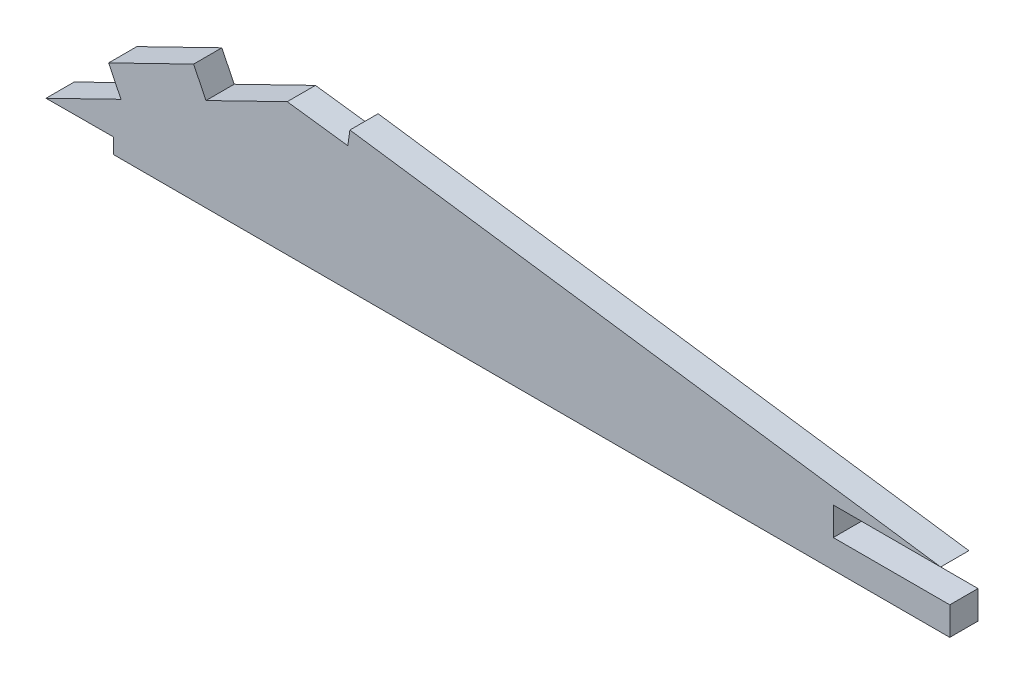
ISO-10303-21;
HEADER;
FILE_DESCRIPTION(('STEP AP214'),'2;1');
FILE_NAME('part.step','',(''),(''),'','','');
FILE_SCHEMA(('AUTOMOTIVE_DESIGN { 1 0 10303 214 1 1 1 1 }'));
ENDSEC;
DATA;
#1=APPLICATION_CONTEXT('core data for automotive mechanical design processes');
#2=APPLICATION_PROTOCOL_DEFINITION('international standard','automotive_design',2000,#1);
#3=PRODUCT_CONTEXT('',#1,'mechanical');
#4=PRODUCT('Part','Part','',(#3));
#5=PRODUCT_RELATED_PRODUCT_CATEGORY('part','',(#4));
#6=PRODUCT_DEFINITION_FORMATION('','',#4);
#7=PRODUCT_DEFINITION_CONTEXT('part definition',#1,'design');
#8=PRODUCT_DEFINITION('design','',#6,#7);
#9=PRODUCT_DEFINITION_SHAPE('','',#8);
#10=(LENGTH_UNIT() NAMED_UNIT(*) SI_UNIT(.MILLI.,.METRE.));
#11=(NAMED_UNIT(*) PLANE_ANGLE_UNIT() SI_UNIT($,.RADIAN.));
#12=(NAMED_UNIT(*) SI_UNIT($,.STERADIAN.) SOLID_ANGLE_UNIT());
#13=UNCERTAINTY_MEASURE_WITH_UNIT(LENGTH_MEASURE(1.E-05),#10,'distance_accuracy_value','');
#14=(GEOMETRIC_REPRESENTATION_CONTEXT(3) GLOBAL_UNCERTAINTY_ASSIGNED_CONTEXT((#13)) GLOBAL_UNIT_ASSIGNED_CONTEXT((#10,
#11,#12)) REPRESENTATION_CONTEXT('',''));
#15=CARTESIAN_POINT('',(0.,0.,0.));
#16=DIRECTION('',(0.,0.,1.));
#17=DIRECTION('',(1.,0.,0.));
#18=AXIS2_PLACEMENT_3D('',#15,#16,#17);
#19=CARTESIAN_POINT('',(6.87014244644078,3.92865761709263,2.));
#20=DIRECTION('',(-0.00388084579369452,0.999992469489609,0.));
#21=DIRECTION('',(-0.999992469489609,-0.00388084579369452,0.));
#22=AXIS2_PLACEMENT_3D('',#19,#20,#21);
#23=PLANE('',#22);
#24=DIRECTION('',(0.999992469489609,0.00388084579369452,0.));
#25=VECTOR('',#24,1.);
#26=CARTESIAN_POINT('',(6.87014244644078,3.92865761709263,0.));
#27=LINE('',#26,#25);
#28=CARTESIAN_POINT('',(2.08867664819272,3.91010134592361,0.));
#29=VERTEX_POINT('',#28);
#30=CARTESIAN_POINT('',(6.87014244644078,3.92865761709263,0.));
#31=VERTEX_POINT('',#30);
#32=EDGE_CURVE('E172',#29,#31,#27,.T.);
#33=ORIENTED_EDGE('',*,*,#32,.T.);
#34=DIRECTION('',(0.,0.,-1.));
#35=VECTOR('',#34,1.);
#36=CARTESIAN_POINT('',(6.87014244644078,3.92865761709263,2.));
#37=LINE('',#36,#35);
#38=CARTESIAN_POINT('',(6.87014244644078,3.92865761709263,2.));
#39=VERTEX_POINT('',#38);
#40=EDGE_CURVE('E11',#39,#31,#37,.T.);
#41=ORIENTED_EDGE('',*,*,#40,.F.);
#42=DIRECTION('',(0.999992469489609,0.00388084579369452,0.));
#43=VECTOR('',#42,1.);
#44=CARTESIAN_POINT('',(6.87014244644078,3.92865761709263,2.));
#45=LINE('',#44,#43);
#46=CARTESIAN_POINT('',(2.08867664819272,3.91010134592361,2.));
#47=VERTEX_POINT('',#46);
#48=EDGE_CURVE('E200',#47,#39,#45,.T.);
#49=ORIENTED_EDGE('',*,*,#48,.F.);
#50=DIRECTION('',(0.,0.,-1.));
#51=VECTOR('',#50,1.);
#52=CARTESIAN_POINT('',(2.08867664819272,3.91010134592361,2.));
#53=LINE('',#52,#51);
#54=EDGE_CURVE('E168',#47,#29,#53,.T.);
#55=ORIENTED_EDGE('',*,*,#54,.T.);
#56=EDGE_LOOP('',(#33,#41,#49,#55));
#57=FACE_BOUND('',#56,.T.);
#58=ADVANCED_FACE('F34',(#57),#23,.F.);
#59=CARTESIAN_POINT('',(6.87434607090663,2.84549352427084,2.));
#60=DIRECTION('',(0.99999246948962,0.00388084579083142,0.));
#61=DIRECTION('',(-0.00388084579083142,0.99999246948962,0.));
#62=AXIS2_PLACEMENT_3D('',#59,#60,#61);
#63=PLANE('',#62);
#64=DIRECTION('',(0.00388084579083142,-0.99999246948962,0.));
#65=VECTOR('',#64,1.);
#66=CARTESIAN_POINT('',(6.87434607090663,2.84549352427084,0.));
#67=LINE('',#66,#65);
#68=CARTESIAN_POINT('',(6.87434607090663,2.84549352427084,0.));
#69=VERTEX_POINT('',#68);
#70=EDGE_CURVE('E175',#31,#69,#67,.T.);
#71=ORIENTED_EDGE('',*,*,#70,.T.);
#72=DIRECTION('',(0.,0.,-1.));
#73=VECTOR('',#72,1.);
#74=CARTESIAN_POINT('',(6.87434607090663,2.84549352427084,2.));
#75=LINE('',#74,#73);
#76=CARTESIAN_POINT('',(6.87434607090663,2.84549352427084,2.));
#77=VERTEX_POINT('',#76);
#78=EDGE_CURVE('E42',#77,#69,#75,.T.);
#79=ORIENTED_EDGE('',*,*,#78,.F.);
#80=DIRECTION('',(0.00388084579083142,-0.99999246948962,0.));
#81=VECTOR('',#80,1.);
#82=CARTESIAN_POINT('',(6.87434607090663,2.84549352427084,2.));
#83=LINE('',#82,#81);
#84=EDGE_CURVE('E114',#39,#77,#83,.T.);
#85=ORIENTED_EDGE('',*,*,#84,.F.);
#86=ORIENTED_EDGE('',*,*,#40,.T.);
#87=EDGE_LOOP('',(#71,#79,#85,#86));
#88=FACE_BOUND('',#87,.T.);
#89=ADVANCED_FACE('F293',(#88),#63,.F.);
#90=CARTESIAN_POINT('',(6.87434607090663,2.84549352427084,2.));
#91=DIRECTION('',(0.,1.,0.));
#92=DIRECTION('',(0.,0.,1.));
#93=AXIS2_PLACEMENT_3D('',#90,#91,#92);
#94=PLANE('',#93);
#95=DIRECTION('',(1.,0.,0.));
#96=VECTOR('',#95,1.);
#97=CARTESIAN_POINT('',(6.87434607090663,2.84549352427084,0.));
#98=LINE('',#97,#96);
#99=CARTESIAN_POINT('',(66.1354490341429,2.84549352427084,0.));
#100=VERTEX_POINT('',#99);
#101=EDGE_CURVE('E177',#69,#100,#98,.T.);
#102=ORIENTED_EDGE('',*,*,#101,.T.);
#103=DIRECTION('',(0.,0.,-1.));
#104=VECTOR('',#103,1.);
#105=CARTESIAN_POINT('',(66.1354490341429,2.84549352427084,2.));
#106=LINE('',#105,#104);
#107=CARTESIAN_POINT('',(66.1354490341429,2.84549352427084,2.));
#108=VERTEX_POINT('',#107);
#109=EDGE_CURVE('E228',#108,#100,#106,.T.);
#110=ORIENTED_EDGE('',*,*,#109,.F.);
#111=DIRECTION('',(1.,0.,0.));
#112=VECTOR('',#111,1.);
#113=CARTESIAN_POINT('',(6.87434607090663,2.84549352427084,2.));
#114=LINE('',#113,#112);
#115=EDGE_CURVE('E236',#77,#108,#114,.T.);
#116=ORIENTED_EDGE('',*,*,#115,.F.);
#117=ORIENTED_EDGE('',*,*,#78,.T.);
#118=EDGE_LOOP('',(#102,#110,#116,#117));
#119=FACE_BOUND('',#118,.T.);
#120=ADVANCED_FACE('F234',(#119),#94,.F.);
#121=CARTESIAN_POINT('',(66.1354490341429,2.84549352427084,2.));
#122=DIRECTION('',(-1.,0.,0.));
#123=DIRECTION('',(0.,0.,1.));
#124=AXIS2_PLACEMENT_3D('',#121,#122,#123);
#125=PLANE('',#124);
#126=DIRECTION('',(0.,1.,0.));
#127=VECTOR('',#126,1.);
#128=CARTESIAN_POINT('',(66.1354490341429,2.84549352427084,0.));
#129=LINE('',#128,#127);
#130=CARTESIAN_POINT('',(66.1354490341429,4.84549352427084,0.));
#131=VERTEX_POINT('',#130);
#132=EDGE_CURVE('E179',#100,#131,#129,.T.);
#133=ORIENTED_EDGE('',*,*,#132,.T.);
#134=DIRECTION('',(0.,0.,-1.));
#135=VECTOR('',#134,1.);
#136=CARTESIAN_POINT('',(66.1354490341429,4.84549352427084,2.));
#137=LINE('',#136,#135);
#138=CARTESIAN_POINT('',(66.1354490341429,4.84549352427084,2.));
#139=VERTEX_POINT('',#138);
#140=EDGE_CURVE('E225',#139,#131,#137,.T.);
#141=ORIENTED_EDGE('',*,*,#140,.F.);
#142=DIRECTION('',(0.,1.,0.));
#143=VECTOR('',#142,1.);
#144=CARTESIAN_POINT('',(66.1354490341429,2.84549352427084,2.));
#145=LINE('',#144,#143);
#146=EDGE_CURVE('E254',#108,#139,#145,.T.);
#147=ORIENTED_EDGE('',*,*,#146,.F.);
#148=ORIENTED_EDGE('',*,*,#109,.T.);
#149=EDGE_LOOP('',(#133,#141,#147,#148));
#150=FACE_BOUND('',#149,.T.);
#151=ADVANCED_FACE('F245',(#150),#125,.F.);
#152=CARTESIAN_POINT('',(57.8792726381617,4.84549352427084,2.));
#153=DIRECTION('',(0.,-1.,0.));
#154=DIRECTION('',(0.,0.,-1.));
#155=AXIS2_PLACEMENT_3D('',#152,#153,#154);
#156=PLANE('',#155);
#157=DIRECTION('',(-1.,0.,0.));
#158=VECTOR('',#157,1.);
#159=CARTESIAN_POINT('',(57.8792726381617,4.84549352427084,0.));
#160=LINE('',#159,#158);
#161=CARTESIAN_POINT('',(57.8792726381617,4.84549352427084,0.));
#162=VERTEX_POINT('',#161);
#163=EDGE_CURVE('E181',#131,#162,#160,.T.);
#164=ORIENTED_EDGE('',*,*,#163,.T.);
#165=DIRECTION('',(0.,0.,-1.));
#166=VECTOR('',#165,1.);
#167=CARTESIAN_POINT('',(57.8792726381617,4.84549352427084,2.));
#168=LINE('',#167,#166);
#169=CARTESIAN_POINT('',(57.8792726381617,4.84549352427084,2.));
#170=VERTEX_POINT('',#169);
#171=EDGE_CURVE('E222',#170,#162,#168,.T.);
#172=ORIENTED_EDGE('',*,*,#171,.F.);
#173=DIRECTION('',(-1.,0.,0.));
#174=VECTOR('',#173,1.);
#175=CARTESIAN_POINT('',(57.8792726381617,4.84549352427084,2.));
#176=LINE('',#175,#174);
#177=EDGE_CURVE('E251',#139,#170,#176,.T.);
#178=ORIENTED_EDGE('',*,*,#177,.F.);
#179=ORIENTED_EDGE('',*,*,#140,.T.);
#180=EDGE_LOOP('',(#164,#172,#178,#179));
#181=FACE_BOUND('',#180,.T.);
#182=ADVANCED_FACE('F249',(#181),#156,.F.);
#183=CARTESIAN_POINT('',(57.8792726381617,4.84549352427084,2.));
#184=DIRECTION('',(-1.,0.,0.));
#185=DIRECTION('',(0.,0.,1.));
#186=AXIS2_PLACEMENT_3D('',#183,#184,#185);
#187=PLANE('',#186);
#188=DIRECTION('',(0.,1.,0.));
#189=VECTOR('',#188,1.);
#190=CARTESIAN_POINT('',(57.8792726381617,4.84549352427084,0.));
#191=LINE('',#190,#189);
#192=CARTESIAN_POINT('',(57.8792726381617,6.84549352427084,0.));
#193=VERTEX_POINT('',#192);
#194=EDGE_CURVE('E183',#162,#193,#191,.T.);
#195=ORIENTED_EDGE('',*,*,#194,.T.);
#196=DIRECTION('',(0.,0.,-1.));
#197=VECTOR('',#196,1.);
#198=CARTESIAN_POINT('',(57.8792726381617,6.84549352427084,2.));
#199=LINE('',#198,#197);
#200=CARTESIAN_POINT('',(57.8792726381617,6.84549352427084,2.));
#201=VERTEX_POINT('',#200);
#202=EDGE_CURVE('E219',#201,#193,#199,.T.);
#203=ORIENTED_EDGE('',*,*,#202,.F.);
#204=DIRECTION('',(0.,1.,0.));
#205=VECTOR('',#204,1.);
#206=CARTESIAN_POINT('',(57.8792726381617,4.84549352427084,2.));
#207=LINE('',#206,#205);
#208=EDGE_CURVE('E253',#170,#201,#207,.T.);
#209=ORIENTED_EDGE('',*,*,#208,.F.);
#210=ORIENTED_EDGE('',*,*,#171,.T.);
#211=EDGE_LOOP('',(#195,#203,#209,#210));
#212=FACE_BOUND('',#211,.T.);
#213=ADVANCED_FACE('F306',(#212),#187,.F.);
#214=CARTESIAN_POINT('',(57.8792726381617,6.84549352427084,2.));
#215=DIRECTION('',(0.,1.,0.));
#216=DIRECTION('',(-1.,0.,0.));
#217=AXIS2_PLACEMENT_3D('',#214,#215,#216);
#218=PLANE('',#217);
#219=DIRECTION('',(1.,0.,0.));
#220=VECTOR('',#219,1.);
#221=CARTESIAN_POINT('',(57.8792726381617,6.84549352427084,0.));
#222=LINE('',#221,#220);
#223=CARTESIAN_POINT('',(65.4894433207147,6.84549352427129,0.));
#224=VERTEX_POINT('',#223);
#225=EDGE_CURVE('E185',#193,#224,#222,.T.);
#226=ORIENTED_EDGE('',*,*,#225,.T.);
#227=DIRECTION('',(0.,0.,-1.));
#228=VECTOR('',#227,1.);
#229=CARTESIAN_POINT('',(65.4894433207147,6.84549352427129,2.));
#230=LINE('',#229,#228);
#231=CARTESIAN_POINT('',(65.4894433207147,6.84549352427129,2.));
#232=VERTEX_POINT('',#231);
#233=EDGE_CURVE('E216',#232,#224,#230,.T.);
#234=ORIENTED_EDGE('',*,*,#233,.F.);
#235=DIRECTION('',(1.,0.,0.));
#236=VECTOR('',#235,1.);
#237=CARTESIAN_POINT('',(57.8792726381617,6.84549352427084,2.));
#238=LINE('',#237,#236);
#239=EDGE_CURVE('E256',#201,#232,#238,.T.);
#240=ORIENTED_EDGE('',*,*,#239,.F.);
#241=ORIENTED_EDGE('',*,*,#202,.T.);
#242=EDGE_LOOP('',(#226,#234,#240,#241));
#243=FACE_BOUND('',#242,.T.);
#244=ADVANCED_FACE('F309',(#243),#218,.F.);
#245=CARTESIAN_POINT('',(23.6243141185087,12.7292537272739,2.));
#246=DIRECTION('',(-0.139173100960091,-0.990268068741567,0.));
#247=DIRECTION('',(0.990268068741567,-0.139173100960091,0.));
#248=AXIS2_PLACEMENT_3D('',#245,#246,#247);
#249=PLANE('',#248);
#250=DIRECTION('',(-0.990268068741567,0.139173100960091,0.));
#251=VECTOR('',#250,1.);
#252=CARTESIAN_POINT('',(23.6243141185087,12.7292537272739,0.));
#253=LINE('',#252,#251);
#254=CARTESIAN_POINT('',(23.6243141185087,12.7292537272739,0.));
#255=VERTEX_POINT('',#254);
#256=EDGE_CURVE('E187',#224,#255,#253,.T.);
#257=ORIENTED_EDGE('',*,*,#256,.T.);
#258=DIRECTION('',(0.,0.,-1.));
#259=VECTOR('',#258,1.);
#260=CARTESIAN_POINT('',(23.6243141185087,12.7292537272739,2.));
#261=LINE('',#260,#259);
#262=CARTESIAN_POINT('',(23.6243141185087,12.7292537272739,2.));
#263=VERTEX_POINT('',#262);
#264=EDGE_CURVE('E213',#263,#255,#261,.T.);
#265=ORIENTED_EDGE('',*,*,#264,.F.);
#266=DIRECTION('',(-0.990268068741567,0.139173100960091,0.));
#267=VECTOR('',#266,1.);
#268=CARTESIAN_POINT('',(23.6243141185087,12.7292537272739,2.));
#269=LINE('',#268,#267);
#270=EDGE_CURVE('E262',#232,#263,#269,.T.);
#271=ORIENTED_EDGE('',*,*,#270,.F.);
#272=ORIENTED_EDGE('',*,*,#233,.T.);
#273=EDGE_LOOP('',(#257,#265,#271,#272));
#274=FACE_BOUND('',#273,.T.);
#275=ADVANCED_FACE('F313',(#274),#249,.F.);
#276=CARTESIAN_POINT('',(23.4761040657177,11.6915614698183,2.));
#277=DIRECTION('',(0.989953726819028,-0.141391720963843,0.));
#278=DIRECTION('',(0.141391720963843,0.989953726819028,0.));
#279=AXIS2_PLACEMENT_3D('',#276,#277,#278);
#280=PLANE('',#279);
#281=DIRECTION('',(-0.141391720963843,-0.989953726819028,0.));
#282=VECTOR('',#281,1.);
#283=CARTESIAN_POINT('',(23.4761040657177,11.6915614698183,0.));
#284=LINE('',#283,#282);
#285=CARTESIAN_POINT('',(23.4761040657177,11.6915614698183,0.));
#286=VERTEX_POINT('',#285);
#287=EDGE_CURVE('E189',#255,#286,#284,.T.);
#288=ORIENTED_EDGE('',*,*,#287,.T.);
#289=DIRECTION('',(0.,0.,-1.));
#290=VECTOR('',#289,1.);
#291=CARTESIAN_POINT('',(23.4761040657177,11.6915614698183,2.));
#292=LINE('',#291,#290);
#293=CARTESIAN_POINT('',(23.4761040657177,11.6915614698183,2.));
#294=VERTEX_POINT('',#293);
#295=EDGE_CURVE('E210',#294,#286,#292,.T.);
#296=ORIENTED_EDGE('',*,*,#295,.F.);
#297=DIRECTION('',(-0.141391720963843,-0.989953726819028,0.));
#298=VECTOR('',#297,1.);
#299=CARTESIAN_POINT('',(23.4761040657177,11.6915614698183,2.));
#300=LINE('',#299,#298);
#301=EDGE_CURVE('E264',#263,#294,#300,.T.);
#302=ORIENTED_EDGE('',*,*,#301,.F.);
#303=ORIENTED_EDGE('',*,*,#264,.T.);
#304=EDGE_LOOP('',(#288,#296,#302,#303));
#305=FACE_BOUND('',#304,.T.);
#306=ADVANCED_FACE('F317',(#305),#280,.F.);
#307=CARTESIAN_POINT('',(19.1818784423468,12.2470129038648,2.));
#308=DIRECTION('',(-0.128279776916055,-0.991738019254262,0.));
#309=DIRECTION('',(0.991738019254262,-0.128279776916055,0.));
#310=AXIS2_PLACEMENT_3D('',#307,#308,#309);
#311=PLANE('',#310);
#312=DIRECTION('',(-0.991738019254262,0.128279776916055,0.));
#313=VECTOR('',#312,1.);
#314=CARTESIAN_POINT('',(19.1818784423468,12.2470129038648,0.));
#315=LINE('',#314,#313);
#316=CARTESIAN_POINT('',(19.1818784423468,12.2470129038648,0.));
#317=VERTEX_POINT('',#316);
#318=EDGE_CURVE('E191',#286,#317,#315,.T.);
#319=ORIENTED_EDGE('',*,*,#318,.T.);
#320=DIRECTION('',(0.,0.,-1.));
#321=VECTOR('',#320,1.);
#322=CARTESIAN_POINT('',(19.1818784423468,12.2470129038648,2.));
#323=LINE('',#322,#321);
#324=CARTESIAN_POINT('',(19.1818784423468,12.2470129038648,2.));
#325=VERTEX_POINT('',#324);
#326=EDGE_CURVE('E207',#325,#317,#323,.T.);
#327=ORIENTED_EDGE('',*,*,#326,.F.);
#328=DIRECTION('',(-0.991738019254262,0.128279776916055,0.));
#329=VECTOR('',#328,1.);
#330=CARTESIAN_POINT('',(19.1818784423468,12.2470129038648,2.));
#331=LINE('',#330,#329);
#332=EDGE_CURVE('E266',#294,#325,#331,.T.);
#333=ORIENTED_EDGE('',*,*,#332,.F.);
#334=ORIENTED_EDGE('',*,*,#295,.T.);
#335=EDGE_LOOP('',(#319,#327,#333,#334));
#336=FACE_BOUND('',#335,.T.);
#337=ADVANCED_FACE('F321',(#336),#311,.F.);
#338=CARTESIAN_POINT('',(13.4256153513143,9.43949580601029,2.));
#339=DIRECTION('',(0.438371146788971,-0.898794046299219,0.));
#340=DIRECTION('',(0.898794046299219,0.438371146788971,0.));
#341=AXIS2_PLACEMENT_3D('',#338,#339,#340);
#342=PLANE('',#341);
#343=DIRECTION('',(-0.898794046299219,-0.438371146788971,0.));
#344=VECTOR('',#343,1.);
#345=CARTESIAN_POINT('',(13.4256153513143,9.43949580601029,0.));
#346=LINE('',#345,#344);
#347=CARTESIAN_POINT('',(13.4256153513143,9.43949580601029,0.));
#348=VERTEX_POINT('',#347);
#349=EDGE_CURVE('E193',#317,#348,#346,.T.);
#350=ORIENTED_EDGE('',*,*,#349,.T.);
#351=DIRECTION('',(0.,0.,-1.));
#352=VECTOR('',#351,1.);
#353=CARTESIAN_POINT('',(13.4256153513143,9.43949580601029,2.));
#354=LINE('',#353,#352);
#355=CARTESIAN_POINT('',(13.4256153513143,9.43949580601029,2.));
#356=VERTEX_POINT('',#355);
#357=EDGE_CURVE('E204',#356,#348,#354,.T.);
#358=ORIENTED_EDGE('',*,*,#357,.F.);
#359=DIRECTION('',(-0.898794046299219,-0.438371146788971,0.));
#360=VECTOR('',#359,1.);
#361=CARTESIAN_POINT('',(13.4256153513143,9.43949580601029,2.));
#362=LINE('',#361,#360);
#363=EDGE_CURVE('E268',#325,#356,#362,.T.);
#364=ORIENTED_EDGE('',*,*,#363,.F.);
#365=ORIENTED_EDGE('',*,*,#326,.T.);
#366=EDGE_LOOP('',(#350,#358,#364,#365));
#367=FACE_BOUND('',#366,.T.);
#368=ADVANCED_FACE('F274',(#367),#342,.F.);
#369=CARTESIAN_POINT('',(12.5488730577354,11.2370838986072,2.));
#370=DIRECTION('',(-0.898794046298885,-0.438371146789656,0.));
#371=DIRECTION('',(0.438371146789656,-0.898794046298885,0.));
#372=AXIS2_PLACEMENT_3D('',#369,#370,#371);
#373=PLANE('',#372);
#374=DIRECTION('',(-0.438371146789656,0.898794046298885,0.));
#375=VECTOR('',#374,1.);
#376=CARTESIAN_POINT('',(12.5488730577354,11.2370838986072,0.));
#377=LINE('',#376,#375);
#378=CARTESIAN_POINT('',(12.5488730577354,11.2370838986072,0.));
#379=VERTEX_POINT('',#378);
#380=EDGE_CURVE('E195',#348,#379,#377,.T.);
#381=ORIENTED_EDGE('',*,*,#380,.T.);
#382=DIRECTION('',(0.,0.,-1.));
#383=VECTOR('',#382,1.);
#384=CARTESIAN_POINT('',(12.5488730577354,11.2370838986072,2.));
#385=LINE('',#384,#383);
#386=CARTESIAN_POINT('',(12.5488730577354,11.2370838986072,2.));
#387=VERTEX_POINT('',#386);
#388=EDGE_CURVE('E163',#387,#379,#385,.T.);
#389=ORIENTED_EDGE('',*,*,#388,.F.);
#390=DIRECTION('',(-0.438371146789656,0.898794046298885,0.));
#391=VECTOR('',#390,1.);
#392=CARTESIAN_POINT('',(12.5488730577354,11.2370838986072,2.));
#393=LINE('',#392,#391);
#394=EDGE_CURVE('E154',#356,#387,#393,.T.);
#395=ORIENTED_EDGE('',*,*,#394,.F.);
#396=ORIENTED_EDGE('',*,*,#357,.T.);
#397=EDGE_LOOP('',(#381,#389,#395,#396));
#398=FACE_BOUND('',#397,.T.);
#399=ADVANCED_FACE('F278',(#398),#373,.F.);
#400=CARTESIAN_POINT('',(6.52650355046089,8.29977802952371,2.));
#401=DIRECTION('',(0.438371146789122,-0.898794046299145,0.));
#402=DIRECTION('',(0.898794046299145,0.438371146789122,0.));
#403=AXIS2_PLACEMENT_3D('',#400,#401,#402);
#404=PLANE('',#403);
#405=DIRECTION('',(-0.898794046299145,-0.438371146789122,0.));
#406=VECTOR('',#405,1.);
#407=CARTESIAN_POINT('',(6.52650355046089,8.29977802952371,0.));
#408=LINE('',#407,#406);
#409=CARTESIAN_POINT('',(6.52650355046089,8.29977802952371,0.));
#410=VERTEX_POINT('',#409);
#411=EDGE_CURVE('E162',#379,#410,#408,.T.);
#412=ORIENTED_EDGE('',*,*,#411,.T.);
#413=DIRECTION('',(0.,0.,-1.));
#414=VECTOR('',#413,1.);
#415=CARTESIAN_POINT('',(6.52650355046089,8.29977802952371,2.));
#416=LINE('',#415,#414);
#417=CARTESIAN_POINT('',(6.52650355046089,8.29977802952371,2.));
#418=VERTEX_POINT('',#417);
#419=EDGE_CURVE('E159',#418,#410,#416,.T.);
#420=ORIENTED_EDGE('',*,*,#419,.F.);
#421=DIRECTION('',(-0.898794046299145,-0.438371146789122,0.));
#422=VECTOR('',#421,1.);
#423=CARTESIAN_POINT('',(6.52650355046089,8.29977802952371,2.));
#424=LINE('',#423,#422);
#425=EDGE_CURVE('E148',#387,#418,#424,.T.);
#426=ORIENTED_EDGE('',*,*,#425,.F.);
#427=ORIENTED_EDGE('',*,*,#388,.T.);
#428=EDGE_LOOP('',(#412,#420,#426,#427));
#429=FACE_BOUND('',#428,.T.);
#430=ADVANCED_FACE('F160',(#429),#404,.F.);
#431=CARTESIAN_POINT('',(6.52650355046089,8.29977802952371,2.));
#432=DIRECTION('',(0.898794046299195,0.43837114678902,0.));
#433=DIRECTION('',(-0.43837114678902,0.898794046299195,0.));
#434=AXIS2_PLACEMENT_3D('',#431,#432,#433);
#435=PLANE('',#434);
#436=DIRECTION('',(0.43837114678902,-0.898794046299195,0.));
#437=VECTOR('',#436,1.);
#438=CARTESIAN_POINT('',(6.52650355046089,8.29977802952371,0.));
#439=LINE('',#438,#437);
#440=CARTESIAN_POINT('',(7.40324584403888,6.50218993692542,0.));
#441=VERTEX_POINT('',#440);
#442=EDGE_CURVE('E100',#410,#441,#439,.T.);
#443=ORIENTED_EDGE('',*,*,#442,.T.);
#444=DIRECTION('',(0.,0.,-1.));
#445=VECTOR('',#444,1.);
#446=CARTESIAN_POINT('',(7.40324584403888,6.50218993692542,2.));
#447=LINE('',#446,#445);
#448=CARTESIAN_POINT('',(7.40324584403888,6.50218993692542,2.));
#449=VERTEX_POINT('',#448);
#450=EDGE_CURVE('E164',#449,#441,#447,.T.);
#451=ORIENTED_EDGE('',*,*,#450,.F.);
#452=DIRECTION('',(0.43837114678902,-0.898794046299195,0.));
#453=VECTOR('',#452,1.);
#454=CARTESIAN_POINT('',(6.52650355046089,8.29977802952371,2.));
#455=LINE('',#454,#453);
#456=EDGE_CURVE('E152',#418,#449,#455,.T.);
#457=ORIENTED_EDGE('',*,*,#456,.F.);
#458=ORIENTED_EDGE('',*,*,#419,.T.);
#459=EDGE_LOOP('',(#443,#451,#457,#458));
#460=FACE_BOUND('',#459,.T.);
#461=ADVANCED_FACE('F166',(#460),#435,.F.);
#462=CARTESIAN_POINT('',(2.08867664819272,3.91010134592361,2.));
#463=DIRECTION('',(0.438371146788992,-0.898794046299209,0.));
#464=DIRECTION('',(0.898794046299209,0.438371146788992,0.));
#465=AXIS2_PLACEMENT_3D('',#462,#463,#464);
#466=PLANE('',#465);
#467=DIRECTION('',(-0.898794046299209,-0.438371146788992,0.));
#468=VECTOR('',#467,1.);
#469=CARTESIAN_POINT('',(2.08867664819272,3.91010134592361,0.));
#470=LINE('',#469,#468);
#471=EDGE_CURVE('E106',#441,#29,#470,.T.);
#472=ORIENTED_EDGE('',*,*,#471,.T.);
#473=ORIENTED_EDGE('',*,*,#54,.F.);
#474=DIRECTION('',(-0.898794046299209,-0.438371146788992,0.));
#475=VECTOR('',#474,1.);
#476=CARTESIAN_POINT('',(2.08867664819272,3.91010134592361,2.));
#477=LINE('',#476,#475);
#478=EDGE_CURVE('E50',#449,#47,#477,.T.);
#479=ORIENTED_EDGE('',*,*,#478,.F.);
#480=ORIENTED_EDGE('',*,*,#450,.T.);
#481=EDGE_LOOP('',(#472,#473,#479,#480));
#482=FACE_BOUND('',#481,.T.);
#483=ADVANCED_FACE('F282',(#482),#466,.F.);
#484=CARTESIAN_POINT('',(0.,0.,2.));
#485=DIRECTION('',(0.,0.,-1.));
#486=DIRECTION('',(-1.,0.,0.));
#487=AXIS2_PLACEMENT_3D('',#484,#485,#486);
#488=PLANE('',#487);
#489=ORIENTED_EDGE('',*,*,#48,.T.);
#490=ORIENTED_EDGE('',*,*,#84,.T.);
#491=ORIENTED_EDGE('',*,*,#115,.T.);
#492=ORIENTED_EDGE('',*,*,#146,.T.);
#493=ORIENTED_EDGE('',*,*,#177,.T.);
#494=ORIENTED_EDGE('',*,*,#208,.T.);
#495=ORIENTED_EDGE('',*,*,#239,.T.);
#496=ORIENTED_EDGE('',*,*,#270,.T.);
#497=ORIENTED_EDGE('',*,*,#301,.T.);
#498=ORIENTED_EDGE('',*,*,#332,.T.);
#499=ORIENTED_EDGE('',*,*,#363,.T.);
#500=ORIENTED_EDGE('',*,*,#394,.T.);
#501=ORIENTED_EDGE('',*,*,#425,.T.);
#502=ORIENTED_EDGE('',*,*,#456,.T.);
#503=ORIENTED_EDGE('',*,*,#478,.T.);
#504=EDGE_LOOP('',(#489,#490,#491,#492,#493,#494,#495,#496,#497,#498,#499,#500,#501,#502,#503));
#505=FACE_BOUND('',#504,.T.);
#506=ADVANCED_FACE('F150',(#505),#488,.F.);
#507=CARTESIAN_POINT('',(0.,0.,0.));
#508=DIRECTION('',(0.,0.,-1.));
#509=DIRECTION('',(-1.,0.,0.));
#510=AXIS2_PLACEMENT_3D('',#507,#508,#509);
#511=PLANE('',#510);
#512=ORIENTED_EDGE('',*,*,#32,.F.);
#513=ORIENTED_EDGE('',*,*,#471,.F.);
#514=ORIENTED_EDGE('',*,*,#442,.F.);
#515=ORIENTED_EDGE('',*,*,#411,.F.);
#516=ORIENTED_EDGE('',*,*,#380,.F.);
#517=ORIENTED_EDGE('',*,*,#349,.F.);
#518=ORIENTED_EDGE('',*,*,#318,.F.);
#519=ORIENTED_EDGE('',*,*,#287,.F.);
#520=ORIENTED_EDGE('',*,*,#256,.F.);
#521=ORIENTED_EDGE('',*,*,#225,.F.);
#522=ORIENTED_EDGE('',*,*,#194,.F.);
#523=ORIENTED_EDGE('',*,*,#163,.F.);
#524=ORIENTED_EDGE('',*,*,#132,.F.);
#525=ORIENTED_EDGE('',*,*,#101,.F.);
#526=ORIENTED_EDGE('',*,*,#70,.F.);
#527=EDGE_LOOP('',(#512,#513,#514,#515,#516,#517,#518,#519,#520,#521,#522,#523,#524,#525,#526));
#528=FACE_BOUND('',#527,.T.);
#529=ADVANCED_FACE('F240',(#528),#511,.T.);
#530=CLOSED_SHELL('',(#58,#89,#120,#151,#182,#213,#244,#275,#306,#337,#368,#399,#430,#461,#483,
#506,#529));
#531=MANIFOLD_SOLID_BREP('B2',#530);
#532=ADVANCED_BREP_SHAPE_REPRESENTATION('',(#18,#531),#14);
#533=SHAPE_DEFINITION_REPRESENTATION(#9,#532);
ENDSEC;
END-ISO-10303-21;
